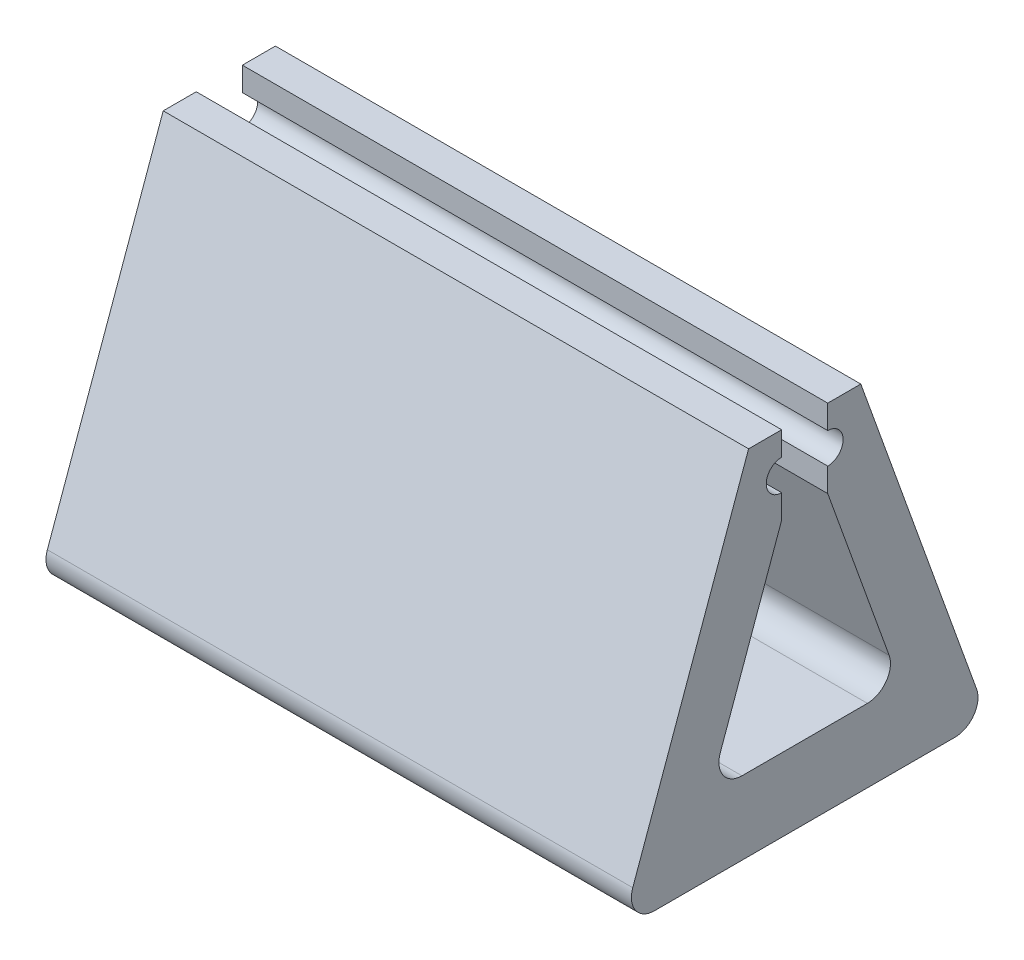
ISO-10303-21;
HEADER;
FILE_DESCRIPTION(('STEP AP214'),'2;1');
FILE_NAME('part.step','',(''),(''),'','','');
FILE_SCHEMA(('AUTOMOTIVE_DESIGN { 1 0 10303 214 1 1 1 1 }'));
ENDSEC;
DATA;
#1=APPLICATION_CONTEXT('core data for automotive mechanical design processes');
#2=APPLICATION_PROTOCOL_DEFINITION('international standard','automotive_design',2000,#1);
#3=PRODUCT_CONTEXT('',#1,'mechanical');
#4=PRODUCT('Part','Part','',(#3));
#5=PRODUCT_RELATED_PRODUCT_CATEGORY('part','',(#4));
#6=PRODUCT_DEFINITION_FORMATION('','',#4);
#7=PRODUCT_DEFINITION_CONTEXT('part definition',#1,'design');
#8=PRODUCT_DEFINITION('design','',#6,#7);
#9=PRODUCT_DEFINITION_SHAPE('','',#8);
#10=(LENGTH_UNIT() NAMED_UNIT(*) SI_UNIT(.MILLI.,.METRE.));
#11=(NAMED_UNIT(*) PLANE_ANGLE_UNIT() SI_UNIT($,.RADIAN.));
#12=(NAMED_UNIT(*) SI_UNIT($,.STERADIAN.) SOLID_ANGLE_UNIT());
#13=UNCERTAINTY_MEASURE_WITH_UNIT(LENGTH_MEASURE(1.E-05),#10,'distance_accuracy_value','');
#14=(GEOMETRIC_REPRESENTATION_CONTEXT(3) GLOBAL_UNCERTAINTY_ASSIGNED_CONTEXT((#13)) GLOBAL_UNIT_ASSIGNED_CONTEXT((#10,
#11,#12)) REPRESENTATION_CONTEXT('',''));
#15=CARTESIAN_POINT('',(0.,0.,0.));
#16=DIRECTION('',(0.,0.,1.));
#17=DIRECTION('',(1.,0.,0.));
#18=AXIS2_PLACEMENT_3D('',#15,#16,#17);
#19=CARTESIAN_POINT('',(15.24,-1.90477719164571,0.));
#20=DIRECTION('',(0.,-1.,0.));
#21=DIRECTION('',(0.,0.,-1.));
#22=AXIS2_PLACEMENT_3D('',#19,#20,#21);
#23=PLANE('',#22);
#24=DIRECTION('',(0.,0.,1.));
#25=VECTOR('',#24,1.);
#26=CARTESIAN_POINT('',(0.,-1.90477719164571,0.));
#27=LINE('',#26,#25);
#28=CARTESIAN_POINT('',(0.,-1.90477719164571,-3.91197002151497));
#29=VERTEX_POINT('',#28);
#30=CARTESIAN_POINT('',(0.,-1.90477719164571,3.91197002151497));
#31=VERTEX_POINT('',#30);
#32=EDGE_CURVE('E188',#29,#31,#27,.T.);
#33=ORIENTED_EDGE('',*,*,#32,.F.);
#34=DIRECTION('',(-1.,0.,0.));
#35=VECTOR('',#34,1.);
#36=CARTESIAN_POINT('',(15.24,-1.90477719164571,-3.91197002151497));
#37=LINE('',#36,#35);
#38=CARTESIAN_POINT('',(15.24,-1.90477719164571,-3.91197002151497));
#39=VERTEX_POINT('',#38);
#40=EDGE_CURVE('E11',#39,#29,#37,.T.);
#41=ORIENTED_EDGE('',*,*,#40,.F.);
#42=DIRECTION('',(0.,0.,1.));
#43=VECTOR('',#42,1.);
#44=CARTESIAN_POINT('',(15.24,-1.90477719164571,0.));
#45=LINE('',#44,#43);
#46=CARTESIAN_POINT('',(15.24,-1.90477719164571,3.91197002151497));
#47=VERTEX_POINT('',#46);
#48=EDGE_CURVE('E234',#39,#47,#45,.T.);
#49=ORIENTED_EDGE('',*,*,#48,.T.);
#50=DIRECTION('',(-1.,0.,0.));
#51=VECTOR('',#50,1.);
#52=CARTESIAN_POINT('',(15.24,-1.90477719164571,3.91197002151497));
#53=LINE('',#52,#51);
#54=EDGE_CURVE('E51',#47,#31,#53,.T.);
#55=ORIENTED_EDGE('',*,*,#54,.T.);
#56=EDGE_LOOP('',(#33,#41,#49,#55));
#57=FACE_BOUND('',#56,.T.);
#58=ADVANCED_FACE('F35',(#57),#23,.T.);
#59=CARTESIAN_POINT('',(15.24,-1.30477719164571,-3.91197002151497));
#60=DIRECTION('',(-1.,0.,0.));
#61=DIRECTION('',(0.,0.,1.));
#62=AXIS2_PLACEMENT_3D('',#59,#60,#61);
#63=CYLINDRICAL_SURFACE('',#62,0.6);
#64=CARTESIAN_POINT('',(0.,-1.30477719164571,-3.91197002151497));
#65=DIRECTION('',(1.,0.,0.));
#66=DIRECTION('',(0.,0.,-1.));
#67=AXIS2_PLACEMENT_3D('',#64,#65,#66);
#68=CIRCLE('',#67,0.6);
#69=CARTESIAN_POINT('',(0.,-1.10175721410872,-4.47657863703627));
#70=VERTEX_POINT('',#69);
#71=EDGE_CURVE('E190',#29,#70,#68,.T.);
#72=ORIENTED_EDGE('',*,*,#71,.T.);
#73=DIRECTION('',(-1.,0.,0.));
#74=VECTOR('',#73,1.);
#75=CARTESIAN_POINT('',(15.24,-1.10175721410872,-4.47657863703627));
#76=LINE('',#75,#74);
#77=CARTESIAN_POINT('',(15.24,-1.10175721410872,-4.47657863703627));
#78=VERTEX_POINT('',#77);
#79=EDGE_CURVE('E43',#78,#70,#76,.T.);
#80=ORIENTED_EDGE('',*,*,#79,.F.);
#81=CARTESIAN_POINT('',(15.24,-1.30477719164571,-3.91197002151497));
#82=DIRECTION('',(1.,0.,0.));
#83=DIRECTION('',(0.,0.,-1.));
#84=AXIS2_PLACEMENT_3D('',#81,#82,#83);
#85=CIRCLE('',#84,0.6);
#86=EDGE_CURVE('E282',#39,#78,#85,.T.);
#87=ORIENTED_EDGE('',*,*,#86,.F.);
#88=ORIENTED_EDGE('',*,*,#40,.T.);
#89=EDGE_LOOP('',(#72,#80,#87,#88));
#90=FACE_BOUND('',#89,.T.);
#91=ADVANCED_FACE('F271',(#90),#63,.T.);
#92=CARTESIAN_POINT('',(15.24,1.2992354492519,-3.61323815093355));
#93=DIRECTION('',(0.,0.338366629228311,-0.94101435920217));
#94=DIRECTION('',(0.,0.94101435920217,0.338366629228311));
#95=AXIS2_PLACEMENT_3D('',#92,#93,#94);
#96=PLANE('',#95);
#97=DIRECTION('',(0.,-0.94101435920217,-0.338366629228311));
#98=VECTOR('',#97,1.);
#99=CARTESIAN_POINT('',(0.,1.2992354492519,-3.61323815093355));
#100=LINE('',#99,#98);
#101=CARTESIAN_POINT('',(0.,7.2858611920325,-1.46058834997456));
#102=VERTEX_POINT('',#101);
#103=EDGE_CURVE('E193',#102,#70,#100,.T.);
#104=ORIENTED_EDGE('',*,*,#103,.F.);
#105=DIRECTION('',(-1.,0.,0.));
#106=VECTOR('',#105,1.);
#107=CARTESIAN_POINT('',(15.24,7.2858611920325,-1.46058834997456));
#108=LINE('',#107,#106);
#109=CARTESIAN_POINT('',(15.24,7.2858611920325,-1.46058834997456));
#110=VERTEX_POINT('',#109);
#111=EDGE_CURVE('E261',#110,#102,#108,.T.);
#112=ORIENTED_EDGE('',*,*,#111,.F.);
#113=DIRECTION('',(0.,-0.94101435920217,-0.338366629228311));
#114=VECTOR('',#113,1.);
#115=CARTESIAN_POINT('',(15.24,1.2992354492519,-3.61323815093355));
#116=LINE('',#115,#114);
#117=EDGE_CURVE('E268',#110,#78,#116,.T.);
#118=ORIENTED_EDGE('',*,*,#117,.T.);
#119=ORIENTED_EDGE('',*,*,#79,.T.);
#120=EDGE_LOOP('',(#104,#112,#118,#119));
#121=FACE_BOUND('',#120,.T.);
#122=ADVANCED_FACE('F266',(#121),#96,.T.);
#123=CARTESIAN_POINT('',(15.24,7.2858611920325,0.));
#124=DIRECTION('',(0.,1.,0.));
#125=DIRECTION('',(0.,0.,1.));
#126=AXIS2_PLACEMENT_3D('',#123,#124,#125);
#127=PLANE('',#126);
#128=DIRECTION('',(0.,0.,-1.));
#129=VECTOR('',#128,1.);
#130=CARTESIAN_POINT('',(0.,7.2858611920325,0.));
#131=LINE('',#130,#129);
#132=CARTESIAN_POINT('',(0.,7.2858611920325,-0.6));
#133=VERTEX_POINT('',#132);
#134=EDGE_CURVE('E196',#133,#102,#131,.T.);
#135=ORIENTED_EDGE('',*,*,#134,.F.);
#136=DIRECTION('',(-1.,0.,0.));
#137=VECTOR('',#136,1.);
#138=CARTESIAN_POINT('',(15.24,7.2858611920325,-0.6));
#139=LINE('',#138,#137);
#140=CARTESIAN_POINT('',(15.24,7.2858611920325,-0.6));
#141=VERTEX_POINT('',#140);
#142=EDGE_CURVE('E259',#141,#133,#139,.T.);
#143=ORIENTED_EDGE('',*,*,#142,.F.);
#144=DIRECTION('',(0.,0.,-1.));
#145=VECTOR('',#144,1.);
#146=CARTESIAN_POINT('',(15.24,7.2858611920325,0.));
#147=LINE('',#146,#145);
#148=EDGE_CURVE('E281',#141,#110,#147,.T.);
#149=ORIENTED_EDGE('',*,*,#148,.T.);
#150=ORIENTED_EDGE('',*,*,#111,.T.);
#151=EDGE_LOOP('',(#135,#143,#149,#150));
#152=FACE_BOUND('',#151,.T.);
#153=ADVANCED_FACE('F277',(#152),#127,.T.);
#154=CARTESIAN_POINT('',(15.24,0.,-0.6));
#155=DIRECTION('',(0.,0.,-1.));
#156=DIRECTION('',(0.,1.,0.));
#157=AXIS2_PLACEMENT_3D('',#154,#155,#156);
#158=PLANE('',#157);
#159=DIRECTION('',(0.,-1.,0.));
#160=VECTOR('',#159,1.);
#161=CARTESIAN_POINT('',(0.,0.,-0.6));
#162=LINE('',#161,#160);
#163=CARTESIAN_POINT('',(0.,6.66599997391257,-0.6));
#164=VERTEX_POINT('',#163);
#165=EDGE_CURVE('E199',#133,#164,#162,.T.);
#166=ORIENTED_EDGE('',*,*,#165,.T.);
#167=DIRECTION('',(-1.,0.,0.));
#168=VECTOR('',#167,1.);
#169=CARTESIAN_POINT('',(15.24,6.66599997391257,-0.6));
#170=LINE('',#169,#168);
#171=CARTESIAN_POINT('',(15.24,6.66599997391257,-0.6));
#172=VERTEX_POINT('',#171);
#173=EDGE_CURVE('E257',#172,#164,#170,.T.);
#174=ORIENTED_EDGE('',*,*,#173,.F.);
#175=DIRECTION('',(0.,-1.,0.));
#176=VECTOR('',#175,1.);
#177=CARTESIAN_POINT('',(15.24,0.,-0.6));
#178=LINE('',#177,#176);
#179=EDGE_CURVE('E284',#141,#172,#178,.T.);
#180=ORIENTED_EDGE('',*,*,#179,.F.);
#181=ORIENTED_EDGE('',*,*,#142,.T.);
#182=EDGE_LOOP('',(#166,#174,#180,#181));
#183=FACE_BOUND('',#182,.T.);
#184=ADVANCED_FACE('F340',(#183),#158,.F.);
#185=CARTESIAN_POINT('',(15.24,6.26599997391257,-0.6));
#186=DIRECTION('',(-1.,0.,0.));
#187=DIRECTION('',(0.,0.,1.));
#188=AXIS2_PLACEMENT_3D('',#185,#186,#187);
#189=CYLINDRICAL_SURFACE('',#188,0.4);
#190=CARTESIAN_POINT('',(0.,6.26599997391257,-0.6));
#191=DIRECTION('',(1.,0.,0.));
#192=DIRECTION('',(0.,0.,-1.));
#193=AXIS2_PLACEMENT_3D('',#190,#191,#192);
#194=CIRCLE('',#193,0.4);
#195=CARTESIAN_POINT('',(0.,5.86599997391257,-0.6));
#196=VERTEX_POINT('',#195);
#197=EDGE_CURVE('E202',#196,#164,#194,.T.);
#198=ORIENTED_EDGE('',*,*,#197,.F.);
#199=DIRECTION('',(-1.,0.,0.));
#200=VECTOR('',#199,1.);
#201=CARTESIAN_POINT('',(15.24,5.86599997391257,-0.6));
#202=LINE('',#201,#200);
#203=CARTESIAN_POINT('',(15.24,5.86599997391257,-0.6));
#204=VERTEX_POINT('',#203);
#205=EDGE_CURVE('E255',#204,#196,#202,.T.);
#206=ORIENTED_EDGE('',*,*,#205,.F.);
#207=CARTESIAN_POINT('',(15.24,6.26599997391257,-0.6));
#208=DIRECTION('',(1.,0.,0.));
#209=DIRECTION('',(0.,0.,-1.));
#210=AXIS2_PLACEMENT_3D('',#207,#208,#209);
#211=CIRCLE('',#210,0.4);
#212=EDGE_CURVE('E290',#204,#172,#211,.T.);
#213=ORIENTED_EDGE('',*,*,#212,.T.);
#214=ORIENTED_EDGE('',*,*,#173,.T.);
#215=EDGE_LOOP('',(#198,#206,#213,#214));
#216=FACE_BOUND('',#215,.T.);
#217=ADVANCED_FACE('F341',(#216),#189,.F.);
#218=CARTESIAN_POINT('',(0.,5.24613875579264,-0.6));
#219=VERTEX_POINT('',#218);
#220=EDGE_CURVE('E203',#196,#219,#162,.T.);
#221=ORIENTED_EDGE('',*,*,#220,.T.);
#222=DIRECTION('',(-1.,0.,0.));
#223=VECTOR('',#222,1.);
#224=CARTESIAN_POINT('',(15.24,5.24613875579264,-0.6));
#225=LINE('',#224,#223);
#226=CARTESIAN_POINT('',(15.24,5.24613875579264,-0.6));
#227=VERTEX_POINT('',#226);
#228=EDGE_CURVE('E252',#227,#219,#225,.T.);
#229=ORIENTED_EDGE('',*,*,#228,.F.);
#230=EDGE_CURVE('E291',#204,#227,#178,.T.);
#231=ORIENTED_EDGE('',*,*,#230,.F.);
#232=ORIENTED_EDGE('',*,*,#205,.T.);
#233=EDGE_LOOP('',(#221,#229,#231,#232));
#234=FACE_BOUND('',#233,.T.);
#235=ADVANCED_FACE('F344',(#234),#158,.F.);
#236=CARTESIAN_POINT('',(15.24,0.791685505409435,-2.2017166121303));
#237=DIRECTION('',(0.,0.338366629228311,-0.94101435920217));
#238=DIRECTION('',(0.,0.94101435920217,0.338366629228311));
#239=AXIS2_PLACEMENT_3D('',#236,#237,#238);
#240=PLANE('',#239);
#241=DIRECTION('',(0.,-0.94101435920217,-0.338366629228311));
#242=VECTOR('',#241,1.);
#243=CARTESIAN_POINT('',(0.,0.791685505409435,-2.2017166121303));
#244=LINE('',#243,#242);
#245=CARTESIAN_POINT('',(0.,0.803019977536987,-2.19764100256029));
#246=VERTEX_POINT('',#245);
#247=EDGE_CURVE('E206',#219,#246,#244,.T.);
#248=ORIENTED_EDGE('',*,*,#247,.T.);
#249=DIRECTION('',(-1.,0.,0.));
#250=VECTOR('',#249,1.);
#251=CARTESIAN_POINT('',(15.24,0.803019977536987,-2.19764100256029));
#252=LINE('',#251,#250);
#253=CARTESIAN_POINT('',(15.24,0.803019977536987,-2.19764100256029));
#254=VERTEX_POINT('',#253);
#255=EDGE_CURVE('E250',#254,#246,#252,.T.);
#256=ORIENTED_EDGE('',*,*,#255,.F.);
#257=DIRECTION('',(0.,-0.94101435920217,-0.338366629228311));
#258=VECTOR('',#257,1.);
#259=CARTESIAN_POINT('',(15.24,0.791685505409435,-2.2017166121303));
#260=LINE('',#259,#258);
#261=EDGE_CURVE('E294',#227,#254,#260,.T.);
#262=ORIENTED_EDGE('',*,*,#261,.F.);
#263=ORIENTED_EDGE('',*,*,#228,.T.);
#264=EDGE_LOOP('',(#248,#256,#262,#263));
#265=FACE_BOUND('',#264,.T.);
#266=ADVANCED_FACE('F348',(#265),#240,.F.);
#267=CARTESIAN_POINT('',(15.24,0.6,-1.63303238703898));
#268=DIRECTION('',(-1.,0.,0.));
#269=DIRECTION('',(0.,0.,1.));
#270=AXIS2_PLACEMENT_3D('',#267,#268,#269);
#271=CYLINDRICAL_SURFACE('',#270,0.600000000000001);
#272=CARTESIAN_POINT('',(0.,0.6,-1.63303238703898));
#273=DIRECTION('',(1.,0.,0.));
#274=DIRECTION('',(0.,0.,-1.));
#275=AXIS2_PLACEMENT_3D('',#272,#273,#274);
#276=CIRCLE('',#275,0.600000000000001);
#277=CARTESIAN_POINT('',(0.,0.,-1.63303238703898));
#278=VERTEX_POINT('',#277);
#279=EDGE_CURVE('E209',#278,#246,#276,.T.);
#280=ORIENTED_EDGE('',*,*,#279,.F.);
#281=DIRECTION('',(-1.,0.,0.));
#282=VECTOR('',#281,1.);
#283=CARTESIAN_POINT('',(15.24,0.,-1.63303238703898));
#284=LINE('',#283,#282);
#285=CARTESIAN_POINT('',(15.24,0.,-1.63303238703898));
#286=VERTEX_POINT('',#285);
#287=EDGE_CURVE('E248',#286,#278,#284,.T.);
#288=ORIENTED_EDGE('',*,*,#287,.F.);
#289=CARTESIAN_POINT('',(15.24,0.6,-1.63303238703898));
#290=DIRECTION('',(1.,0.,0.));
#291=DIRECTION('',(0.,0.,-1.));
#292=AXIS2_PLACEMENT_3D('',#289,#290,#291);
#293=CIRCLE('',#292,0.600000000000001);
#294=EDGE_CURVE('E296',#286,#254,#293,.T.);
#295=ORIENTED_EDGE('',*,*,#294,.T.);
#296=ORIENTED_EDGE('',*,*,#255,.T.);
#297=EDGE_LOOP('',(#280,#288,#295,#296));
#298=FACE_BOUND('',#297,.T.);
#299=ADVANCED_FACE('F352',(#298),#271,.F.);
#300=CARTESIAN_POINT('',(15.24,0.,0.));
#301=DIRECTION('',(0.,1.,0.));
#302=DIRECTION('',(0.,0.,1.));
#303=AXIS2_PLACEMENT_3D('',#300,#301,#302);
#304=PLANE('',#303);
#305=DIRECTION('',(0.,0.,-1.));
#306=VECTOR('',#305,1.);
#307=CARTESIAN_POINT('',(0.,0.,0.));
#308=LINE('',#307,#306);
#309=CARTESIAN_POINT('',(0.,0.,1.63303238703898));
#310=VERTEX_POINT('',#309);
#311=EDGE_CURVE('E212',#310,#278,#308,.T.);
#312=ORIENTED_EDGE('',*,*,#311,.F.);
#313=DIRECTION('',(-1.,0.,0.));
#314=VECTOR('',#313,1.);
#315=CARTESIAN_POINT('',(15.24,0.,1.63303238703898));
#316=LINE('',#315,#314);
#317=CARTESIAN_POINT('',(15.24,0.,1.63303238703898));
#318=VERTEX_POINT('',#317);
#319=EDGE_CURVE('E246',#318,#310,#316,.T.);
#320=ORIENTED_EDGE('',*,*,#319,.F.);
#321=DIRECTION('',(0.,0.,-1.));
#322=VECTOR('',#321,1.);
#323=CARTESIAN_POINT('',(15.24,0.,0.));
#324=LINE('',#323,#322);
#325=EDGE_CURVE('E299',#318,#286,#324,.T.);
#326=ORIENTED_EDGE('',*,*,#325,.T.);
#327=ORIENTED_EDGE('',*,*,#287,.T.);
#328=EDGE_LOOP('',(#312,#320,#326,#327));
#329=FACE_BOUND('',#328,.T.);
#330=ADVANCED_FACE('F356',(#329),#304,.T.);
#331=CARTESIAN_POINT('',(15.24,0.6,1.63303238703898));
#332=DIRECTION('',(-1.,0.,0.));
#333=DIRECTION('',(0.,0.,1.));
#334=AXIS2_PLACEMENT_3D('',#331,#332,#333);
#335=CYLINDRICAL_SURFACE('',#334,0.600000000000001);
#336=CARTESIAN_POINT('',(0.,0.6,1.63303238703898));
#337=DIRECTION('',(1.,0.,0.));
#338=DIRECTION('',(0.,0.,-1.));
#339=AXIS2_PLACEMENT_3D('',#336,#337,#338);
#340=CIRCLE('',#339,0.600000000000001);
#341=CARTESIAN_POINT('',(0.,0.803019977536987,2.19764100256029));
#342=VERTEX_POINT('',#341);
#343=EDGE_CURVE('E215',#342,#310,#340,.T.);
#344=ORIENTED_EDGE('',*,*,#343,.F.);
#345=DIRECTION('',(-1.,0.,0.));
#346=VECTOR('',#345,1.);
#347=CARTESIAN_POINT('',(15.24,0.803019977536987,2.19764100256029));
#348=LINE('',#347,#346);
#349=CARTESIAN_POINT('',(15.24,0.803019977536987,2.19764100256029));
#350=VERTEX_POINT('',#349);
#351=EDGE_CURVE('E244',#350,#342,#348,.T.);
#352=ORIENTED_EDGE('',*,*,#351,.F.);
#353=CARTESIAN_POINT('',(15.24,0.6,1.63303238703898));
#354=DIRECTION('',(1.,0.,0.));
#355=DIRECTION('',(0.,0.,-1.));
#356=AXIS2_PLACEMENT_3D('',#353,#354,#355);
#357=CIRCLE('',#356,0.600000000000001);
#358=EDGE_CURVE('E302',#350,#318,#357,.T.);
#359=ORIENTED_EDGE('',*,*,#358,.T.);
#360=ORIENTED_EDGE('',*,*,#319,.T.);
#361=EDGE_LOOP('',(#344,#352,#359,#360));
#362=FACE_BOUND('',#361,.T.);
#363=ADVANCED_FACE('F360',(#362),#335,.F.);
#364=CARTESIAN_POINT('',(15.24,0.791685505409435,2.2017166121303));
#365=DIRECTION('',(0.,-0.338366629228311,-0.94101435920217));
#366=DIRECTION('',(0.,0.94101435920217,-0.338366629228311));
#367=AXIS2_PLACEMENT_3D('',#364,#365,#366);
#368=PLANE('',#367);
#369=DIRECTION('',(0.,-0.94101435920217,0.338366629228311));
#370=VECTOR('',#369,1.);
#371=CARTESIAN_POINT('',(0.,0.791685505409435,2.2017166121303));
#372=LINE('',#371,#370);
#373=CARTESIAN_POINT('',(0.,5.24613875579264,0.6));
#374=VERTEX_POINT('',#373);
#375=EDGE_CURVE('E218',#374,#342,#372,.T.);
#376=ORIENTED_EDGE('',*,*,#375,.F.);
#377=DIRECTION('',(-1.,0.,0.));
#378=VECTOR('',#377,1.);
#379=CARTESIAN_POINT('',(15.24,5.24613875579264,0.6));
#380=LINE('',#379,#378);
#381=CARTESIAN_POINT('',(15.24,5.24613875579264,0.6));
#382=VERTEX_POINT('',#381);
#383=EDGE_CURVE('E242',#382,#374,#380,.T.);
#384=ORIENTED_EDGE('',*,*,#383,.F.);
#385=DIRECTION('',(0.,-0.94101435920217,0.338366629228311));
#386=VECTOR('',#385,1.);
#387=CARTESIAN_POINT('',(15.24,0.791685505409435,2.2017166121303));
#388=LINE('',#387,#386);
#389=EDGE_CURVE('E305',#382,#350,#388,.T.);
#390=ORIENTED_EDGE('',*,*,#389,.T.);
#391=ORIENTED_EDGE('',*,*,#351,.T.);
#392=EDGE_LOOP('',(#376,#384,#390,#391));
#393=FACE_BOUND('',#392,.T.);
#394=ADVANCED_FACE('F364',(#393),#368,.T.);
#395=CARTESIAN_POINT('',(15.24,0.,0.599999999999999));
#396=DIRECTION('',(0.,0.,-1.));
#397=DIRECTION('',(0.,1.,0.));
#398=AXIS2_PLACEMENT_3D('',#395,#396,#397);
#399=PLANE('',#398);
#400=DIRECTION('',(0.,-1.,0.));
#401=VECTOR('',#400,1.);
#402=CARTESIAN_POINT('',(0.,0.,0.599999999999999));
#403=LINE('',#402,#401);
#404=CARTESIAN_POINT('',(0.,5.86599997391257,0.6));
#405=VERTEX_POINT('',#404);
#406=EDGE_CURVE('E221',#405,#374,#403,.T.);
#407=ORIENTED_EDGE('',*,*,#406,.F.);
#408=DIRECTION('',(-1.,0.,0.));
#409=VECTOR('',#408,1.);
#410=CARTESIAN_POINT('',(15.24,5.86599997391257,0.6));
#411=LINE('',#410,#409);
#412=CARTESIAN_POINT('',(15.24,5.86599997391257,0.6));
#413=VERTEX_POINT('',#412);
#414=EDGE_CURVE('E240',#413,#405,#411,.T.);
#415=ORIENTED_EDGE('',*,*,#414,.F.);
#416=DIRECTION('',(0.,-1.,0.));
#417=VECTOR('',#416,1.);
#418=CARTESIAN_POINT('',(15.24,0.,0.599999999999999));
#419=LINE('',#418,#417);
#420=EDGE_CURVE('E308',#413,#382,#419,.T.);
#421=ORIENTED_EDGE('',*,*,#420,.T.);
#422=ORIENTED_EDGE('',*,*,#383,.T.);
#423=EDGE_LOOP('',(#407,#415,#421,#422));
#424=FACE_BOUND('',#423,.T.);
#425=ADVANCED_FACE('F368',(#424),#399,.T.);
#426=CARTESIAN_POINT('',(15.24,6.26599997391257,0.6));
#427=DIRECTION('',(-1.,0.,0.));
#428=DIRECTION('',(0.,0.,1.));
#429=AXIS2_PLACEMENT_3D('',#426,#427,#428);
#430=CYLINDRICAL_SURFACE('',#429,0.4);
#431=CARTESIAN_POINT('',(0.,6.26599997391257,0.6));
#432=DIRECTION('',(1.,0.,0.));
#433=DIRECTION('',(0.,0.,-1.));
#434=AXIS2_PLACEMENT_3D('',#431,#432,#433);
#435=CIRCLE('',#434,0.4);
#436=CARTESIAN_POINT('',(0.,6.66599997391257,0.6));
#437=VERTEX_POINT('',#436);
#438=EDGE_CURVE('E224',#405,#437,#435,.F.);
#439=ORIENTED_EDGE('',*,*,#438,.T.);
#440=DIRECTION('',(-1.,0.,0.));
#441=VECTOR('',#440,1.);
#442=CARTESIAN_POINT('',(15.24,6.66599997391257,0.6));
#443=LINE('',#442,#441);
#444=CARTESIAN_POINT('',(15.24,6.66599997391257,0.6));
#445=VERTEX_POINT('',#444);
#446=EDGE_CURVE('E238',#445,#437,#443,.T.);
#447=ORIENTED_EDGE('',*,*,#446,.F.);
#448=CARTESIAN_POINT('',(15.24,6.26599997391257,0.6));
#449=DIRECTION('',(1.,0.,0.));
#450=DIRECTION('',(0.,0.,-1.));
#451=AXIS2_PLACEMENT_3D('',#448,#449,#450);
#452=CIRCLE('',#451,0.4);
#453=EDGE_CURVE('E310',#413,#445,#452,.F.);
#454=ORIENTED_EDGE('',*,*,#453,.F.);
#455=ORIENTED_EDGE('',*,*,#414,.T.);
#456=EDGE_LOOP('',(#439,#447,#454,#455));
#457=FACE_BOUND('',#456,.T.);
#458=ADVANCED_FACE('F370',(#457),#430,.F.);
#459=CARTESIAN_POINT('',(0.,7.2858611920325,0.6));
#460=VERTEX_POINT('',#459);
#461=EDGE_CURVE('E225',#460,#437,#403,.T.);
#462=ORIENTED_EDGE('',*,*,#461,.F.);
#463=DIRECTION('',(-1.,0.,0.));
#464=VECTOR('',#463,1.);
#465=CARTESIAN_POINT('',(15.24,7.2858611920325,0.6));
#466=LINE('',#465,#464);
#467=CARTESIAN_POINT('',(15.24,7.2858611920325,0.6));
#468=VERTEX_POINT('',#467);
#469=EDGE_CURVE('E170',#468,#460,#466,.T.);
#470=ORIENTED_EDGE('',*,*,#469,.F.);
#471=EDGE_CURVE('E180',#468,#445,#419,.T.);
#472=ORIENTED_EDGE('',*,*,#471,.T.);
#473=ORIENTED_EDGE('',*,*,#446,.T.);
#474=EDGE_LOOP('',(#462,#470,#472,#473));
#475=FACE_BOUND('',#474,.T.);
#476=ADVANCED_FACE('F316',(#475),#399,.T.);
#477=CARTESIAN_POINT('',(15.24,7.2858611920325,0.));
#478=DIRECTION('',(0.,1.,0.));
#479=DIRECTION('',(0.,0.,1.));
#480=AXIS2_PLACEMENT_3D('',#477,#478,#479);
#481=PLANE('',#480);
#482=DIRECTION('',(0.,0.,-1.));
#483=VECTOR('',#482,1.);
#484=CARTESIAN_POINT('',(0.,7.2858611920325,0.));
#485=LINE('',#484,#483);
#486=CARTESIAN_POINT('',(0.,7.2858611920325,1.46058834997456));
#487=VERTEX_POINT('',#486);
#488=EDGE_CURVE('E166',#487,#460,#485,.T.);
#489=ORIENTED_EDGE('',*,*,#488,.F.);
#490=DIRECTION('',(-1.,0.,0.));
#491=VECTOR('',#490,1.);
#492=CARTESIAN_POINT('',(15.24,7.2858611920325,1.46058834997456));
#493=LINE('',#492,#491);
#494=CARTESIAN_POINT('',(15.24,7.2858611920325,1.46058834997456));
#495=VERTEX_POINT('',#494);
#496=EDGE_CURVE('E161',#495,#487,#493,.T.);
#497=ORIENTED_EDGE('',*,*,#496,.F.);
#498=DIRECTION('',(0.,0.,-1.));
#499=VECTOR('',#498,1.);
#500=CARTESIAN_POINT('',(15.24,7.2858611920325,0.));
#501=LINE('',#500,#499);
#502=EDGE_CURVE('E164',#495,#468,#501,.T.);
#503=ORIENTED_EDGE('',*,*,#502,.T.);
#504=ORIENTED_EDGE('',*,*,#469,.T.);
#505=EDGE_LOOP('',(#489,#497,#503,#504));
#506=FACE_BOUND('',#505,.T.);
#507=ADVANCED_FACE('F163',(#506),#481,.T.);
#508=CARTESIAN_POINT('',(15.24,1.2992354492519,3.61323815093355));
#509=DIRECTION('',(0.,0.338366629228311,0.94101435920217));
#510=DIRECTION('',(0.,-0.94101435920217,0.338366629228311));
#511=AXIS2_PLACEMENT_3D('',#508,#509,#510);
#512=PLANE('',#511);
#513=DIRECTION('',(0.,0.94101435920217,-0.338366629228311));
#514=VECTOR('',#513,1.);
#515=CARTESIAN_POINT('',(0.,1.2992354492519,3.61323815093355));
#516=LINE('',#515,#514);
#517=CARTESIAN_POINT('',(0.,-1.10175721410872,4.47657863703627));
#518=VERTEX_POINT('',#517);
#519=EDGE_CURVE('E229',#518,#487,#516,.T.);
#520=ORIENTED_EDGE('',*,*,#519,.F.);
#521=DIRECTION('',(-1.,0.,0.));
#522=VECTOR('',#521,1.);
#523=CARTESIAN_POINT('',(15.24,-1.10175721410872,4.47657863703627));
#524=LINE('',#523,#522);
#525=CARTESIAN_POINT('',(15.24,-1.10175721410872,4.47657863703627));
#526=VERTEX_POINT('',#525);
#527=EDGE_CURVE('E106',#526,#518,#524,.T.);
#528=ORIENTED_EDGE('',*,*,#527,.F.);
#529=DIRECTION('',(0.,0.94101435920217,-0.338366629228311));
#530=VECTOR('',#529,1.);
#531=CARTESIAN_POINT('',(15.24,1.2992354492519,3.61323815093355));
#532=LINE('',#531,#530);
#533=EDGE_CURVE('E178',#526,#495,#532,.T.);
#534=ORIENTED_EDGE('',*,*,#533,.T.);
#535=ORIENTED_EDGE('',*,*,#496,.T.);
#536=EDGE_LOOP('',(#520,#528,#534,#535));
#537=FACE_BOUND('',#536,.T.);
#538=ADVANCED_FACE('F182',(#537),#512,.T.);
#539=CARTESIAN_POINT('',(15.24,-1.30477719164571,3.91197002151497));
#540=DIRECTION('',(-1.,0.,0.));
#541=DIRECTION('',(0.,0.,1.));
#542=AXIS2_PLACEMENT_3D('',#539,#540,#541);
#543=CYLINDRICAL_SURFACE('',#542,0.6);
#544=CARTESIAN_POINT('',(0.,-1.30477719164571,3.91197002151497));
#545=DIRECTION('',(1.,0.,0.));
#546=DIRECTION('',(0.,0.,-1.));
#547=AXIS2_PLACEMENT_3D('',#544,#545,#546);
#548=CIRCLE('',#547,0.6);
#549=EDGE_CURVE('E231',#31,#518,#548,.F.);
#550=ORIENTED_EDGE('',*,*,#549,.F.);
#551=ORIENTED_EDGE('',*,*,#54,.F.);
#552=CARTESIAN_POINT('',(15.24,-1.30477719164571,3.91197002151497));
#553=DIRECTION('',(1.,0.,0.));
#554=DIRECTION('',(0.,0.,-1.));
#555=AXIS2_PLACEMENT_3D('',#552,#553,#554);
#556=CIRCLE('',#555,0.6);
#557=EDGE_CURVE('E183',#47,#526,#556,.F.);
#558=ORIENTED_EDGE('',*,*,#557,.T.);
#559=ORIENTED_EDGE('',*,*,#527,.T.);
#560=EDGE_LOOP('',(#550,#551,#558,#559));
#561=FACE_BOUND('',#560,.T.);
#562=ADVANCED_FACE('F319',(#561),#543,.T.);
#563=CARTESIAN_POINT('',(15.24,0.,0.));
#564=DIRECTION('',(1.,0.,0.));
#565=DIRECTION('',(0.,0.,-1.));
#566=AXIS2_PLACEMENT_3D('',#563,#564,#565);
#567=PLANE('',#566);
#568=ORIENTED_EDGE('',*,*,#48,.F.);
#569=ORIENTED_EDGE('',*,*,#86,.T.);
#570=ORIENTED_EDGE('',*,*,#117,.F.);
#571=ORIENTED_EDGE('',*,*,#148,.F.);
#572=ORIENTED_EDGE('',*,*,#179,.T.);
#573=ORIENTED_EDGE('',*,*,#212,.F.);
#574=ORIENTED_EDGE('',*,*,#230,.T.);
#575=ORIENTED_EDGE('',*,*,#261,.T.);
#576=ORIENTED_EDGE('',*,*,#294,.F.);
#577=ORIENTED_EDGE('',*,*,#325,.F.);
#578=ORIENTED_EDGE('',*,*,#358,.F.);
#579=ORIENTED_EDGE('',*,*,#389,.F.);
#580=ORIENTED_EDGE('',*,*,#420,.F.);
#581=ORIENTED_EDGE('',*,*,#453,.T.);
#582=ORIENTED_EDGE('',*,*,#471,.F.);
#583=ORIENTED_EDGE('',*,*,#502,.F.);
#584=ORIENTED_EDGE('',*,*,#533,.F.);
#585=ORIENTED_EDGE('',*,*,#557,.F.);
#586=EDGE_LOOP('',(#568,#569,#570,#571,#572,#573,#574,#575,#576,#577,#578,#579,#580,#581,#582,
#583,#584,#585));
#587=FACE_BOUND('',#586,.T.);
#588=ADVANCED_FACE('F176',(#587),#567,.T.);
#589=CARTESIAN_POINT('',(0.,0.,0.));
#590=DIRECTION('',(1.,0.,0.));
#591=DIRECTION('',(0.,0.,-1.));
#592=AXIS2_PLACEMENT_3D('',#589,#590,#591);
#593=PLANE('',#592);
#594=ORIENTED_EDGE('',*,*,#32,.T.);
#595=ORIENTED_EDGE('',*,*,#549,.T.);
#596=ORIENTED_EDGE('',*,*,#519,.T.);
#597=ORIENTED_EDGE('',*,*,#488,.T.);
#598=ORIENTED_EDGE('',*,*,#461,.T.);
#599=ORIENTED_EDGE('',*,*,#438,.F.);
#600=ORIENTED_EDGE('',*,*,#406,.T.);
#601=ORIENTED_EDGE('',*,*,#375,.T.);
#602=ORIENTED_EDGE('',*,*,#343,.T.);
#603=ORIENTED_EDGE('',*,*,#311,.T.);
#604=ORIENTED_EDGE('',*,*,#279,.T.);
#605=ORIENTED_EDGE('',*,*,#247,.F.);
#606=ORIENTED_EDGE('',*,*,#220,.F.);
#607=ORIENTED_EDGE('',*,*,#197,.T.);
#608=ORIENTED_EDGE('',*,*,#165,.F.);
#609=ORIENTED_EDGE('',*,*,#134,.T.);
#610=ORIENTED_EDGE('',*,*,#103,.T.);
#611=ORIENTED_EDGE('',*,*,#71,.F.);
#612=EDGE_LOOP('',(#594,#595,#596,#597,#598,#599,#600,#601,#602,#603,#604,#605,#606,#607,#608,
#609,#610,#611));
#613=FACE_BOUND('',#612,.T.);
#614=ADVANCED_FACE('F273',(#613),#593,.F.);
#615=CLOSED_SHELL('',(#58,#91,#122,#153,#184,#217,#235,#266,#299,#330,#363,#394,#425,#458,#476,
#507,#538,#562,#588,#614));
#616=MANIFOLD_SOLID_BREP('B2',#615);
#617=ADVANCED_BREP_SHAPE_REPRESENTATION('',(#18,#616),#14);
#618=SHAPE_DEFINITION_REPRESENTATION(#9,#617);
ENDSEC;
END-ISO-10303-21;
